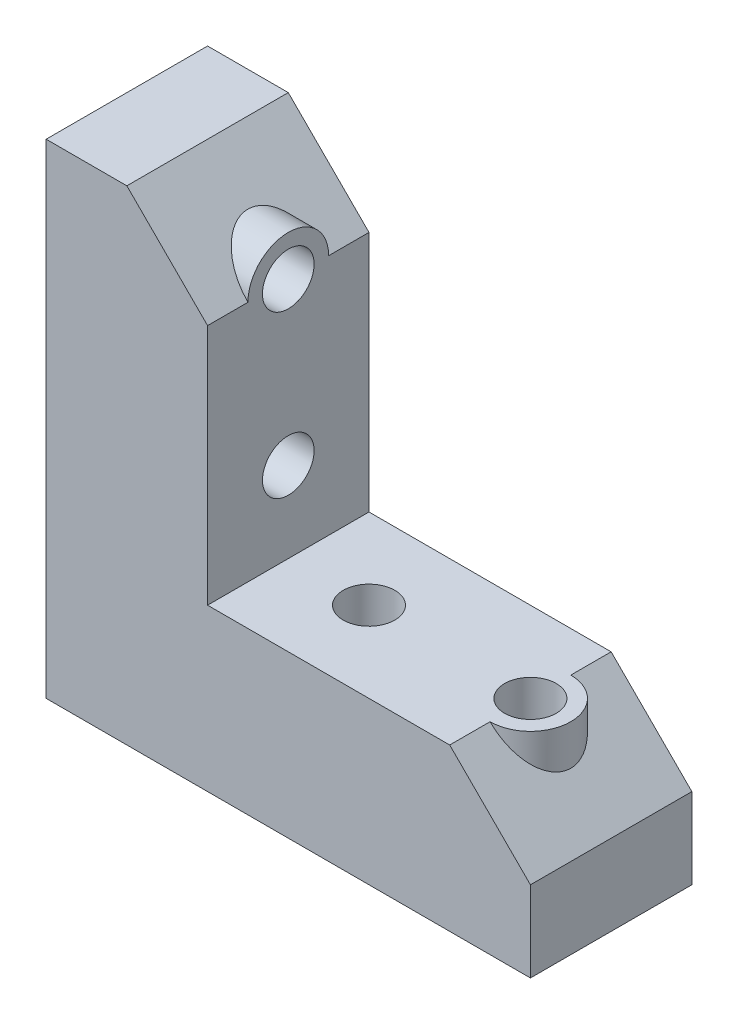
ISO-10303-21;
HEADER;
FILE_DESCRIPTION(('STEP AP214'),'2;1');
FILE_NAME('part.step','',(''),(''),'','','');
FILE_SCHEMA(('AUTOMOTIVE_DESIGN { 1 0 10303 214 1 1 1 1 }'));
ENDSEC;
DATA;
#1=APPLICATION_CONTEXT('core data for automotive mechanical design processes');
#2=APPLICATION_PROTOCOL_DEFINITION('international standard','automotive_design',2000,#1);
#3=PRODUCT_CONTEXT('',#1,'mechanical');
#4=PRODUCT('Part','Part','',(#3));
#5=PRODUCT_RELATED_PRODUCT_CATEGORY('part','',(#4));
#6=PRODUCT_DEFINITION_FORMATION('','',#4);
#7=PRODUCT_DEFINITION_CONTEXT('part definition',#1,'design');
#8=PRODUCT_DEFINITION('design','',#6,#7);
#9=PRODUCT_DEFINITION_SHAPE('','',#8);
#10=(LENGTH_UNIT() NAMED_UNIT(*) SI_UNIT(.MILLI.,.METRE.));
#11=(NAMED_UNIT(*) PLANE_ANGLE_UNIT() SI_UNIT($,.RADIAN.));
#12=(NAMED_UNIT(*) SI_UNIT($,.STERADIAN.) SOLID_ANGLE_UNIT());
#13=UNCERTAINTY_MEASURE_WITH_UNIT(LENGTH_MEASURE(1.E-05),#10,'distance_accuracy_value','');
#14=(GEOMETRIC_REPRESENTATION_CONTEXT(3) GLOBAL_UNCERTAINTY_ASSIGNED_CONTEXT((#13)) GLOBAL_UNIT_ASSIGNED_CONTEXT((#10,
#11,#12)) REPRESENTATION_CONTEXT('',''));
#15=CARTESIAN_POINT('',(0.,0.,0.));
#16=DIRECTION('',(0.,0.,1.));
#17=DIRECTION('',(1.,0.,0.));
#18=AXIS2_PLACEMENT_3D('',#15,#16,#17);
#19=CARTESIAN_POINT('',(30.,0.,10.));
#20=DIRECTION('',(0.,1.,0.));
#21=DIRECTION('',(-1.,0.,0.));
#22=AXIS2_PLACEMENT_3D('',#19,#20,#21);
#23=PLANE('',#22);
#24=CARTESIAN_POINT('',(25.,0.,5.));
#25=DIRECTION('',(0.,-1.,0.));
#26=DIRECTION('',(1.,0.,0.));
#27=AXIS2_PLACEMENT_3D('',#24,#25,#26);
#28=CIRCLE('',#27,1.6);
#29=CARTESIAN_POINT('',(26.6,0.,5.));
#30=VERTEX_POINT('',#29);
#31=EDGE_CURVE('E223',#30,#30,#28,.T.);
#32=ORIENTED_EDGE('',*,*,#31,.F.);
#33=EDGE_LOOP('',(#32));
#34=FACE_BOUND('',#33,.T.);
#35=CARTESIAN_POINT('',(15.,0.,5.));
#36=DIRECTION('',(0.,-1.,0.));
#37=DIRECTION('',(1.,0.,0.));
#38=AXIS2_PLACEMENT_3D('',#35,#36,#37);
#39=CIRCLE('',#38,1.6);
#40=CARTESIAN_POINT('',(16.6,0.,5.));
#41=VERTEX_POINT('',#40);
#42=EDGE_CURVE('E220',#41,#41,#39,.T.);
#43=ORIENTED_EDGE('',*,*,#42,.F.);
#44=EDGE_LOOP('',(#43));
#45=FACE_BOUND('',#44,.T.);
#46=DIRECTION('',(1.,0.,0.));
#47=VECTOR('',#46,1.);
#48=CARTESIAN_POINT('',(30.,0.,0.));
#49=LINE('',#48,#47);
#50=CARTESIAN_POINT('',(0.,0.,0.));
#51=VERTEX_POINT('',#50);
#52=CARTESIAN_POINT('',(30.,0.,0.));
#53=VERTEX_POINT('',#52);
#54=EDGE_CURVE('E196',#51,#53,#49,.T.);
#55=ORIENTED_EDGE('',*,*,#54,.T.);
#56=DIRECTION('',(0.,0.,-1.));
#57=VECTOR('',#56,1.);
#58=CARTESIAN_POINT('',(30.,0.,10.));
#59=LINE('',#58,#57);
#60=CARTESIAN_POINT('',(30.,0.,10.));
#61=VERTEX_POINT('',#60);
#62=EDGE_CURVE('E173',#61,#53,#59,.T.);
#63=ORIENTED_EDGE('',*,*,#62,.F.);
#64=DIRECTION('',(1.,0.,0.));
#65=VECTOR('',#64,1.);
#66=CARTESIAN_POINT('',(30.,0.,10.));
#67=LINE('',#66,#65);
#68=CARTESIAN_POINT('',(0.,0.,10.));
#69=VERTEX_POINT('',#68);
#70=EDGE_CURVE('E187',#69,#61,#67,.T.);
#71=ORIENTED_EDGE('',*,*,#70,.F.);
#72=DIRECTION('',(0.,0.,-1.));
#73=VECTOR('',#72,1.);
#74=CARTESIAN_POINT('',(0.,0.,10.));
#75=LINE('',#74,#73);
#76=EDGE_CURVE('E182',#69,#51,#75,.T.);
#77=ORIENTED_EDGE('',*,*,#76,.T.);
#78=EDGE_LOOP('',(#55,#63,#71,#77));
#79=FACE_BOUND('',#78,.T.);
#80=ADVANCED_FACE('F33',(#34,#45,#79),#23,.F.);
#81=CARTESIAN_POINT('',(30.,10.,10.));
#82=DIRECTION('',(-1.,0.,0.));
#83=DIRECTION('',(0.,0.,1.));
#84=AXIS2_PLACEMENT_3D('',#81,#82,#83);
#85=PLANE('',#84);
#86=DIRECTION('',(0.,1.,0.));
#87=VECTOR('',#86,1.);
#88=CARTESIAN_POINT('',(30.,10.,0.));
#89=LINE('',#88,#87);
#90=CARTESIAN_POINT('',(30.,4.99999999999999,0.));
#91=VERTEX_POINT('',#90);
#92=EDGE_CURVE('E194',#53,#91,#89,.T.);
#93=ORIENTED_EDGE('',*,*,#92,.T.);
#94=DIRECTION('',(0.,0.,1.));
#95=VECTOR('',#94,1.);
#96=CARTESIAN_POINT('',(30.,4.99999999999999,10.));
#97=LINE('',#96,#95);
#98=CARTESIAN_POINT('',(30.,4.99999999999999,10.));
#99=VERTEX_POINT('',#98);
#100=EDGE_CURVE('E56',#91,#99,#97,.T.);
#101=ORIENTED_EDGE('',*,*,#100,.T.);
#102=DIRECTION('',(0.,1.,0.));
#103=VECTOR('',#102,1.);
#104=CARTESIAN_POINT('',(30.,10.,10.));
#105=LINE('',#104,#103);
#106=EDGE_CURVE('E203',#61,#99,#105,.T.);
#107=ORIENTED_EDGE('',*,*,#106,.F.);
#108=ORIENTED_EDGE('',*,*,#62,.T.);
#109=EDGE_LOOP('',(#93,#101,#107,#108));
#110=FACE_BOUND('',#109,.T.);
#111=ADVANCED_FACE('F233',(#110),#85,.F.);
#112=CARTESIAN_POINT('',(10.,10.,10.));
#113=DIRECTION('',(0.,-1.,0.));
#114=DIRECTION('',(0.,0.,-1.));
#115=AXIS2_PLACEMENT_3D('',#112,#113,#114);
#116=PLANE('',#115);
#117=CARTESIAN_POINT('',(15.,10.,5.));
#118=DIRECTION('',(0.,-1.,0.));
#119=DIRECTION('',(1.,0.,0.));
#120=AXIS2_PLACEMENT_3D('',#117,#118,#119);
#121=CIRCLE('',#120,1.6);
#122=CARTESIAN_POINT('',(16.6,10.,5.));
#123=VERTEX_POINT('',#122);
#124=EDGE_CURVE('E219',#123,#123,#121,.T.);
#125=ORIENTED_EDGE('',*,*,#124,.T.);
#126=EDGE_LOOP('',(#125));
#127=FACE_BOUND('',#126,.T.);
#128=DIRECTION('',(0.,0.,-1.));
#129=VECTOR('',#128,1.);
#130=CARTESIAN_POINT('',(25.,10.,10.));
#131=LINE('',#130,#129);
#132=CARTESIAN_POINT('',(25.,10.,10.));
#133=VERTEX_POINT('',#132);
#134=CARTESIAN_POINT('',(25.,10.,7.5));
#135=VERTEX_POINT('',#134);
#136=EDGE_CURVE('E120',#133,#135,#131,.T.);
#137=ORIENTED_EDGE('',*,*,#136,.T.);
#138=CARTESIAN_POINT('',(25.,10.,5.));
#139=DIRECTION('',(0.,-1.,0.));
#140=DIRECTION('',(1.,0.,0.));
#141=AXIS2_PLACEMENT_3D('',#138,#139,#140);
#142=CIRCLE('',#141,2.5);
#143=CARTESIAN_POINT('',(25.,10.,2.5));
#144=VERTEX_POINT('',#143);
#145=EDGE_CURVE('E109',#144,#135,#142,.T.);
#146=ORIENTED_EDGE('',*,*,#145,.F.);
#147=CARTESIAN_POINT('',(25.,10.,0.));
#148=VERTEX_POINT('',#147);
#149=EDGE_CURVE('E122',#144,#148,#131,.T.);
#150=ORIENTED_EDGE('',*,*,#149,.T.);
#151=DIRECTION('',(-1.,0.,0.));
#152=VECTOR('',#151,1.);
#153=CARTESIAN_POINT('',(10.,10.,0.));
#154=LINE('',#153,#152);
#155=CARTESIAN_POINT('',(10.,10.,0.));
#156=VERTEX_POINT('',#155);
#157=EDGE_CURVE('E192',#148,#156,#154,.T.);
#158=ORIENTED_EDGE('',*,*,#157,.T.);
#159=DIRECTION('',(0.,0.,-1.));
#160=VECTOR('',#159,1.);
#161=CARTESIAN_POINT('',(10.,10.,10.));
#162=LINE('',#161,#160);
#163=CARTESIAN_POINT('',(10.,10.,10.));
#164=VERTEX_POINT('',#163);
#165=EDGE_CURVE('E176',#164,#156,#162,.T.);
#166=ORIENTED_EDGE('',*,*,#165,.F.);
#167=DIRECTION('',(-1.,0.,0.));
#168=VECTOR('',#167,1.);
#169=CARTESIAN_POINT('',(10.,10.,10.));
#170=LINE('',#169,#168);
#171=EDGE_CURVE('E126',#133,#164,#170,.T.);
#172=ORIENTED_EDGE('',*,*,#171,.F.);
#173=EDGE_LOOP('',(#137,#146,#150,#158,#166,#172));
#174=FACE_BOUND('',#173,.T.);
#175=CARTESIAN_POINT('',(25.,10.,5.));
#176=DIRECTION('',(0.,-1.,0.));
#177=DIRECTION('',(1.,0.,0.));
#178=AXIS2_PLACEMENT_3D('',#175,#176,#177);
#179=CIRCLE('',#178,1.6);
#180=CARTESIAN_POINT('',(26.6,10.,5.));
#181=VERTEX_POINT('',#180);
#182=EDGE_CURVE('E116',#181,#181,#179,.T.);
#183=ORIENTED_EDGE('',*,*,#182,.T.);
#184=EDGE_LOOP('',(#183));
#185=FACE_BOUND('',#184,.T.);
#186=ADVANCED_FACE('F123',(#127,#174,#185),#116,.F.);
#187=CARTESIAN_POINT('',(10.,30.,10.));
#188=DIRECTION('',(-1.,0.,0.));
#189=DIRECTION('',(0.,-1.,0.));
#190=AXIS2_PLACEMENT_3D('',#187,#188,#189);
#191=PLANE('',#190);
#192=CARTESIAN_POINT('',(10.,15.,5.));
#193=DIRECTION('',(-1.,0.,0.));
#194=DIRECTION('',(0.,0.,1.));
#195=AXIS2_PLACEMENT_3D('',#192,#193,#194);
#196=CIRCLE('',#195,1.6);
#197=CARTESIAN_POINT('',(10.,15.,6.6));
#198=VERTEX_POINT('',#197);
#199=EDGE_CURVE('E199',#198,#198,#196,.T.);
#200=ORIENTED_EDGE('',*,*,#199,.T.);
#201=EDGE_LOOP('',(#200));
#202=FACE_BOUND('',#201,.T.);
#203=DIRECTION('',(0.,0.,1.));
#204=VECTOR('',#203,1.);
#205=CARTESIAN_POINT('',(10.,25.,10.));
#206=LINE('',#205,#204);
#207=CARTESIAN_POINT('',(10.,25.,0.));
#208=VERTEX_POINT('',#207);
#209=CARTESIAN_POINT('',(10.,25.,2.49999999999997));
#210=VERTEX_POINT('',#209);
#211=EDGE_CURVE('E147',#208,#210,#206,.T.);
#212=ORIENTED_EDGE('',*,*,#211,.T.);
#213=CARTESIAN_POINT('',(10.,25.,4.99999999999997));
#214=DIRECTION('',(-1.,0.,0.));
#215=DIRECTION('',(0.,0.,1.));
#216=AXIS2_PLACEMENT_3D('',#213,#214,#215);
#217=CIRCLE('',#216,2.5);
#218=CARTESIAN_POINT('',(10.,25.,7.49999999999997));
#219=VERTEX_POINT('',#218);
#220=EDGE_CURVE('E115',#219,#210,#217,.T.);
#221=ORIENTED_EDGE('',*,*,#220,.F.);
#222=CARTESIAN_POINT('',(10.,25.,10.));
#223=VERTEX_POINT('',#222);
#224=EDGE_CURVE('E144',#219,#223,#206,.T.);
#225=ORIENTED_EDGE('',*,*,#224,.T.);
#226=DIRECTION('',(0.,1.,0.));
#227=VECTOR('',#226,1.);
#228=CARTESIAN_POINT('',(10.,30.,10.));
#229=LINE('',#228,#227);
#230=EDGE_CURVE('E162',#164,#223,#229,.T.);
#231=ORIENTED_EDGE('',*,*,#230,.F.);
#232=ORIENTED_EDGE('',*,*,#165,.T.);
#233=DIRECTION('',(0.,1.,0.));
#234=VECTOR('',#233,1.);
#235=CARTESIAN_POINT('',(10.,30.,0.));
#236=LINE('',#235,#234);
#237=EDGE_CURVE('E190',#156,#208,#236,.T.);
#238=ORIENTED_EDGE('',*,*,#237,.T.);
#239=EDGE_LOOP('',(#212,#221,#225,#231,#232,#238));
#240=FACE_BOUND('',#239,.T.);
#241=CARTESIAN_POINT('',(10.,25.,4.99999999999997));
#242=DIRECTION('',(-1.,0.,0.));
#243=DIRECTION('',(0.,0.,1.));
#244=AXIS2_PLACEMENT_3D('',#241,#242,#243);
#245=CIRCLE('',#244,1.6);
#246=CARTESIAN_POINT('',(10.,25.,6.59999999999996));
#247=VERTEX_POINT('',#246);
#248=EDGE_CURVE('E210',#247,#247,#245,.T.);
#249=ORIENTED_EDGE('',*,*,#248,.T.);
#250=EDGE_LOOP('',(#249));
#251=FACE_BOUND('',#250,.T.);
#252=ADVANCED_FACE('F141',(#202,#240,#251),#191,.F.);
#253=CARTESIAN_POINT('',(0.,30.,10.));
#254=DIRECTION('',(0.,-1.,0.));
#255=DIRECTION('',(0.,0.,-1.));
#256=AXIS2_PLACEMENT_3D('',#253,#254,#255);
#257=PLANE('',#256);
#258=DIRECTION('',(-1.,0.,0.));
#259=VECTOR('',#258,1.);
#260=CARTESIAN_POINT('',(0.,30.,10.));
#261=LINE('',#260,#259);
#262=CARTESIAN_POINT('',(5.,30.,10.));
#263=VERTEX_POINT('',#262);
#264=CARTESIAN_POINT('',(0.,30.,10.));
#265=VERTEX_POINT('',#264);
#266=EDGE_CURVE('E160',#263,#265,#261,.T.);
#267=ORIENTED_EDGE('',*,*,#266,.F.);
#268=DIRECTION('',(0.,0.,-1.));
#269=VECTOR('',#268,1.);
#270=CARTESIAN_POINT('',(5.,30.,10.));
#271=LINE('',#270,#269);
#272=CARTESIAN_POINT('',(5.,30.,0.));
#273=VERTEX_POINT('',#272);
#274=EDGE_CURVE('E166',#263,#273,#271,.T.);
#275=ORIENTED_EDGE('',*,*,#274,.T.);
#276=DIRECTION('',(-1.,0.,0.));
#277=VECTOR('',#276,1.);
#278=CARTESIAN_POINT('',(0.,30.,0.));
#279=LINE('',#278,#277);
#280=CARTESIAN_POINT('',(0.,30.,0.));
#281=VERTEX_POINT('',#280);
#282=EDGE_CURVE('E188',#273,#281,#279,.T.);
#283=ORIENTED_EDGE('',*,*,#282,.T.);
#284=DIRECTION('',(0.,0.,-1.));
#285=VECTOR('',#284,1.);
#286=CARTESIAN_POINT('',(0.,30.,10.));
#287=LINE('',#286,#285);
#288=EDGE_CURVE('E169',#265,#281,#287,.T.);
#289=ORIENTED_EDGE('',*,*,#288,.F.);
#290=EDGE_LOOP('',(#267,#275,#283,#289));
#291=FACE_BOUND('',#290,.T.);
#292=ADVANCED_FACE('F165',(#291),#257,.F.);
#293=CARTESIAN_POINT('',(0.,0.,10.));
#294=DIRECTION('',(1.,0.,0.));
#295=DIRECTION('',(0.,0.,-1.));
#296=AXIS2_PLACEMENT_3D('',#293,#294,#295);
#297=PLANE('',#296);
#298=CARTESIAN_POINT('',(0.,15.,5.));
#299=DIRECTION('',(-1.,0.,0.));
#300=DIRECTION('',(0.,0.,1.));
#301=AXIS2_PLACEMENT_3D('',#298,#299,#300);
#302=CIRCLE('',#301,1.6);
#303=CARTESIAN_POINT('',(0.,15.,6.6));
#304=VERTEX_POINT('',#303);
#305=EDGE_CURVE('E207',#304,#304,#302,.T.);
#306=ORIENTED_EDGE('',*,*,#305,.F.);
#307=EDGE_LOOP('',(#306));
#308=FACE_BOUND('',#307,.T.);
#309=DIRECTION('',(0.,-1.,0.));
#310=VECTOR('',#309,1.);
#311=CARTESIAN_POINT('',(0.,0.,0.));
#312=LINE('',#311,#310);
#313=EDGE_CURVE('E185',#281,#51,#312,.T.);
#314=ORIENTED_EDGE('',*,*,#313,.T.);
#315=ORIENTED_EDGE('',*,*,#76,.F.);
#316=DIRECTION('',(0.,-1.,0.));
#317=VECTOR('',#316,1.);
#318=CARTESIAN_POINT('',(0.,0.,10.));
#319=LINE('',#318,#317);
#320=EDGE_CURVE('E171',#265,#69,#319,.T.);
#321=ORIENTED_EDGE('',*,*,#320,.F.);
#322=ORIENTED_EDGE('',*,*,#288,.T.);
#323=EDGE_LOOP('',(#314,#315,#321,#322));
#324=FACE_BOUND('',#323,.T.);
#325=CARTESIAN_POINT('',(0.,25.,4.99999999999997));
#326=DIRECTION('',(-1.,0.,0.));
#327=DIRECTION('',(0.,0.,1.));
#328=AXIS2_PLACEMENT_3D('',#325,#326,#327);
#329=CIRCLE('',#328,1.6);
#330=CARTESIAN_POINT('',(0.,25.,6.59999999999996));
#331=VERTEX_POINT('',#330);
#332=EDGE_CURVE('E148',#331,#331,#329,.T.);
#333=ORIENTED_EDGE('',*,*,#332,.F.);
#334=EDGE_LOOP('',(#333));
#335=FACE_BOUND('',#334,.T.);
#336=ADVANCED_FACE('F246',(#308,#324,#335),#297,.F.);
#337=CARTESIAN_POINT('',(0.,0.,10.));
#338=DIRECTION('',(0.,0.,-1.));
#339=DIRECTION('',(-1.,0.,0.));
#340=AXIS2_PLACEMENT_3D('',#337,#338,#339);
#341=PLANE('',#340);
#342=ORIENTED_EDGE('',*,*,#230,.T.);
#343=DIRECTION('',(0.707106781186546,-0.707106781186549,0.));
#344=VECTOR('',#343,1.);
#345=CARTESIAN_POINT('',(5.,30.,10.));
#346=LINE('',#345,#344);
#347=EDGE_CURVE('E129',#223,#263,#346,.F.);
#348=ORIENTED_EDGE('',*,*,#347,.T.);
#349=ORIENTED_EDGE('',*,*,#266,.T.);
#350=ORIENTED_EDGE('',*,*,#320,.T.);
#351=ORIENTED_EDGE('',*,*,#70,.T.);
#352=ORIENTED_EDGE('',*,*,#106,.T.);
#353=DIRECTION('',(0.707106781186546,-0.707106781186549,0.));
#354=VECTOR('',#353,1.);
#355=CARTESIAN_POINT('',(25.,10.,10.));
#356=LINE('',#355,#354);
#357=EDGE_CURVE('E48',#99,#133,#356,.F.);
#358=ORIENTED_EDGE('',*,*,#357,.T.);
#359=ORIENTED_EDGE('',*,*,#171,.T.);
#360=EDGE_LOOP('',(#342,#348,#349,#350,#351,#352,#358,#359));
#361=FACE_BOUND('',#360,.T.);
#362=ADVANCED_FACE('F159',(#361),#341,.F.);
#363=CARTESIAN_POINT('',(0.,0.,0.));
#364=DIRECTION('',(0.,0.,-1.));
#365=DIRECTION('',(-1.,0.,0.));
#366=AXIS2_PLACEMENT_3D('',#363,#364,#365);
#367=PLANE('',#366);
#368=ORIENTED_EDGE('',*,*,#282,.F.);
#369=DIRECTION('',(-0.707106781186546,0.707106781186549,0.));
#370=VECTOR('',#369,1.);
#371=CARTESIAN_POINT('',(17.5,17.5,0.));
#372=LINE('',#371,#370);
#373=EDGE_CURVE('E153',#273,#208,#372,.F.);
#374=ORIENTED_EDGE('',*,*,#373,.T.);
#375=ORIENTED_EDGE('',*,*,#237,.F.);
#376=ORIENTED_EDGE('',*,*,#157,.F.);
#377=DIRECTION('',(-0.707106781186546,0.707106781186549,0.));
#378=VECTOR('',#377,1.);
#379=CARTESIAN_POINT('',(17.5000000000001,17.5,0.));
#380=LINE('',#379,#378);
#381=EDGE_CURVE('E155',#148,#91,#380,.F.);
#382=ORIENTED_EDGE('',*,*,#381,.T.);
#383=ORIENTED_EDGE('',*,*,#92,.F.);
#384=ORIENTED_EDGE('',*,*,#54,.F.);
#385=ORIENTED_EDGE('',*,*,#313,.F.);
#386=EDGE_LOOP('',(#368,#374,#375,#376,#382,#383,#384,#385));
#387=FACE_BOUND('',#386,.T.);
#388=ADVANCED_FACE('F243',(#387),#367,.T.);
#389=CARTESIAN_POINT('',(5.,30.,10.));
#390=DIRECTION('',(-0.707106781186549,-0.707106781186546,0.));
#391=DIRECTION('',(0.,0.,-1.));
#392=AXIS2_PLACEMENT_3D('',#389,#390,#391);
#393=PLANE('',#392);
#394=CARTESIAN_POINT('',(9.99999999999998,25.,4.99999999999997));
#395=DIRECTION('',(-0.707106781186549,-0.707106781186546,0.));
#396=DIRECTION('',(-0.707106781186546,0.707106781186549,0.));
#397=AXIS2_PLACEMENT_3D('',#394,#395,#396);
#398=ELLIPSE('',#397,3.53553390593273,2.5);
#399=EDGE_CURVE('E41',#210,#219,#398,.F.);
#400=ORIENTED_EDGE('',*,*,#399,.F.);
#401=ORIENTED_EDGE('',*,*,#211,.F.);
#402=ORIENTED_EDGE('',*,*,#373,.F.);
#403=ORIENTED_EDGE('',*,*,#274,.F.);
#404=ORIENTED_EDGE('',*,*,#347,.F.);
#405=ORIENTED_EDGE('',*,*,#224,.F.);
#406=EDGE_LOOP('',(#400,#401,#402,#403,#404,#405));
#407=FACE_BOUND('',#406,.T.);
#408=ADVANCED_FACE('F151',(#407),#393,.F.);
#409=CARTESIAN_POINT('',(25.,10.,10.));
#410=DIRECTION('',(-0.707106781186549,-0.707106781186546,0.));
#411=DIRECTION('',(0.,0.,-1.));
#412=AXIS2_PLACEMENT_3D('',#409,#410,#411);
#413=PLANE('',#412);
#414=CARTESIAN_POINT('',(25.,10.,5.));
#415=DIRECTION('',(-0.707106781186549,-0.707106781186546,0.));
#416=DIRECTION('',(0.707106781186546,-0.707106781186549,0.));
#417=AXIS2_PLACEMENT_3D('',#414,#415,#416);
#418=ELLIPSE('',#417,3.53553390593274,2.5);
#419=EDGE_CURVE('E11',#135,#144,#418,.F.);
#420=ORIENTED_EDGE('',*,*,#419,.F.);
#421=ORIENTED_EDGE('',*,*,#136,.F.);
#422=ORIENTED_EDGE('',*,*,#357,.F.);
#423=ORIENTED_EDGE('',*,*,#100,.F.);
#424=ORIENTED_EDGE('',*,*,#381,.F.);
#425=ORIENTED_EDGE('',*,*,#149,.F.);
#426=EDGE_LOOP('',(#420,#421,#422,#423,#424,#425));
#427=FACE_BOUND('',#426,.T.);
#428=ADVANCED_FACE('F35',(#427),#413,.F.);
#429=CARTESIAN_POINT('',(10.,15.,5.));
#430=DIRECTION('',(-1.,0.,0.));
#431=DIRECTION('',(0.,0.,1.));
#432=AXIS2_PLACEMENT_3D('',#429,#430,#431);
#433=CYLINDRICAL_SURFACE('',#432,1.6);
#434=ORIENTED_EDGE('',*,*,#199,.F.);
#435=EDGE_LOOP('',(#434));
#436=FACE_BOUND('',#435,.T.);
#437=ORIENTED_EDGE('',*,*,#305,.T.);
#438=EDGE_LOOP('',(#437));
#439=FACE_BOUND('',#438,.T.);
#440=ADVANCED_FACE('F255',(#436,#439),#433,.F.);
#441=CARTESIAN_POINT('',(10.,25.,4.99999999999997));
#442=DIRECTION('',(-1.,0.,0.));
#443=DIRECTION('',(0.,0.,1.));
#444=AXIS2_PLACEMENT_3D('',#441,#442,#443);
#445=CYLINDRICAL_SURFACE('',#444,1.6);
#446=ORIENTED_EDGE('',*,*,#248,.F.);
#447=EDGE_LOOP('',(#446));
#448=FACE_BOUND('',#447,.T.);
#449=ORIENTED_EDGE('',*,*,#332,.T.);
#450=EDGE_LOOP('',(#449));
#451=FACE_BOUND('',#450,.T.);
#452=ADVANCED_FACE('F253',(#448,#451),#445,.F.);
#453=CARTESIAN_POINT('',(10.,25.,4.99999999999997));
#454=DIRECTION('',(-1.,0.,0.));
#455=DIRECTION('',(0.,0.,1.));
#456=AXIS2_PLACEMENT_3D('',#453,#454,#455);
#457=CYLINDRICAL_SURFACE('',#456,2.5);
#458=ORIENTED_EDGE('',*,*,#220,.T.);
#459=ORIENTED_EDGE('',*,*,#399,.T.);
#460=EDGE_LOOP('',(#458,#459));
#461=FACE_BOUND('',#460,.T.);
#462=ADVANCED_FACE('F135',(#461),#457,.T.);
#463=CARTESIAN_POINT('',(25.,10.,5.));
#464=DIRECTION('',(0.,-1.,0.));
#465=DIRECTION('',(1.,0.,0.));
#466=AXIS2_PLACEMENT_3D('',#463,#464,#465);
#467=CYLINDRICAL_SURFACE('',#466,2.5);
#468=ORIENTED_EDGE('',*,*,#145,.T.);
#469=ORIENTED_EDGE('',*,*,#419,.T.);
#470=EDGE_LOOP('',(#468,#469));
#471=FACE_BOUND('',#470,.T.);
#472=ADVANCED_FACE('F111',(#471),#467,.T.);
#473=CARTESIAN_POINT('',(25.,10.,5.));
#474=DIRECTION('',(0.,-1.,0.));
#475=DIRECTION('',(1.,0.,0.));
#476=AXIS2_PLACEMENT_3D('',#473,#474,#475);
#477=CYLINDRICAL_SURFACE('',#476,1.6);
#478=ORIENTED_EDGE('',*,*,#182,.F.);
#479=EDGE_LOOP('',(#478));
#480=FACE_BOUND('',#479,.T.);
#481=ORIENTED_EDGE('',*,*,#31,.T.);
#482=EDGE_LOOP('',(#481));
#483=FACE_BOUND('',#482,.T.);
#484=ADVANCED_FACE('F229',(#480,#483),#477,.F.);
#485=CARTESIAN_POINT('',(15.,10.,5.));
#486=DIRECTION('',(0.,-1.,0.));
#487=DIRECTION('',(1.,0.,0.));
#488=AXIS2_PLACEMENT_3D('',#485,#486,#487);
#489=CYLINDRICAL_SURFACE('',#488,1.6);
#490=ORIENTED_EDGE('',*,*,#124,.F.);
#491=EDGE_LOOP('',(#490));
#492=FACE_BOUND('',#491,.T.);
#493=ORIENTED_EDGE('',*,*,#42,.T.);
#494=EDGE_LOOP('',(#493));
#495=FACE_BOUND('',#494,.T.);
#496=ADVANCED_FACE('F316',(#492,#495),#489,.F.);
#497=CLOSED_SHELL('',(#80,#111,#186,#252,#292,#336,#362,#388,#408,#428,#440,#452,#462,#472,#484,#496));
#498=MANIFOLD_SOLID_BREP('B2',#497);
#499=ADVANCED_BREP_SHAPE_REPRESENTATION('',(#18,#498),#14);
#500=SHAPE_DEFINITION_REPRESENTATION(#9,#499);
ENDSEC;
END-ISO-10303-21;
